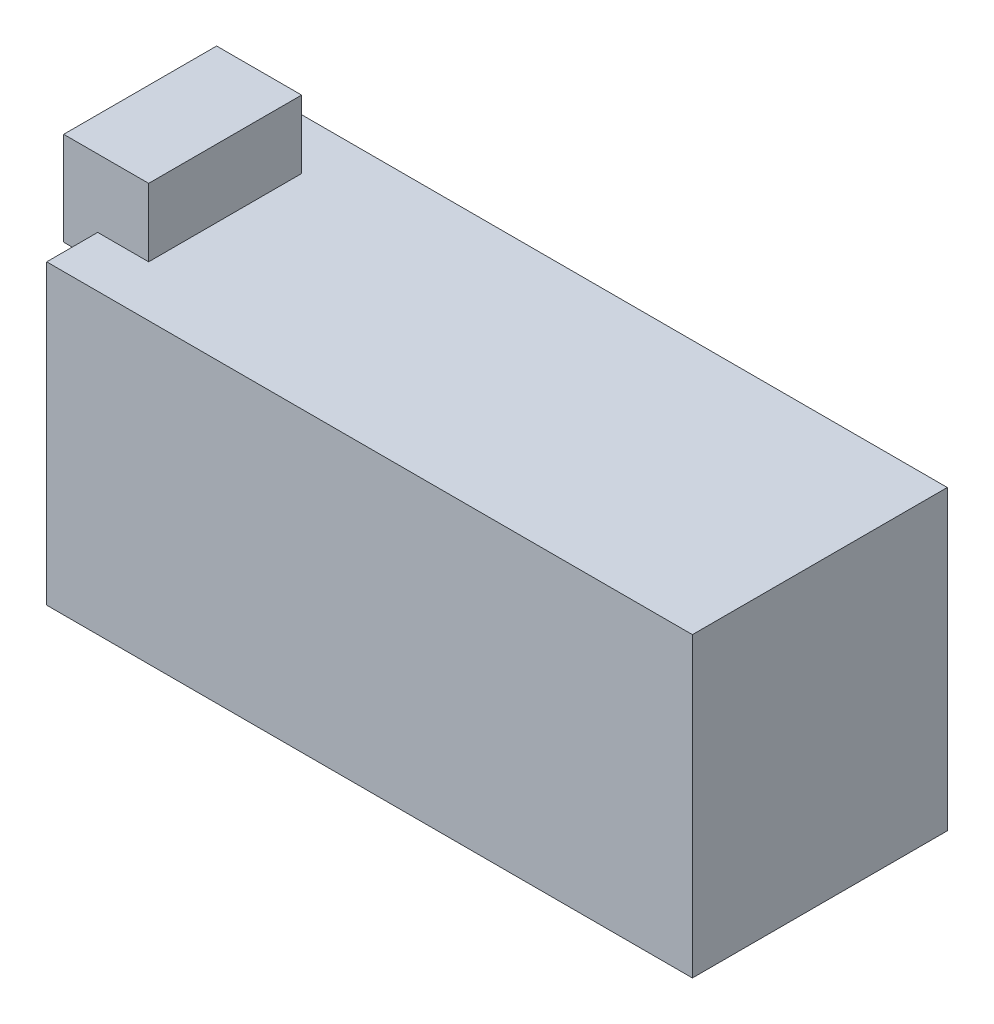
ISO-10303-21;
HEADER;
FILE_DESCRIPTION(('STEP AP214'),'2;1');
FILE_NAME('part.step','',(''),(''),'','','');
FILE_SCHEMA(('AUTOMOTIVE_DESIGN { 1 0 10303 214 1 1 1 1 }'));
ENDSEC;
DATA;
#1=APPLICATION_CONTEXT('core data for automotive mechanical design processes');
#2=APPLICATION_PROTOCOL_DEFINITION('international standard','automotive_design',2000,#1);
#3=PRODUCT_CONTEXT('',#1,'mechanical');
#4=PRODUCT('Part','Part','',(#3));
#5=PRODUCT_RELATED_PRODUCT_CATEGORY('part','',(#4));
#6=PRODUCT_DEFINITION_FORMATION('','',#4);
#7=PRODUCT_DEFINITION_CONTEXT('part definition',#1,'design');
#8=PRODUCT_DEFINITION('design','',#6,#7);
#9=PRODUCT_DEFINITION_SHAPE('','',#8);
#10=(LENGTH_UNIT() NAMED_UNIT(*) SI_UNIT(.MILLI.,.METRE.));
#11=(NAMED_UNIT(*) PLANE_ANGLE_UNIT() SI_UNIT($,.RADIAN.));
#12=(NAMED_UNIT(*) SI_UNIT($,.STERADIAN.) SOLID_ANGLE_UNIT());
#13=UNCERTAINTY_MEASURE_WITH_UNIT(LENGTH_MEASURE(1.E-05),#10,'distance_accuracy_value','');
#14=(GEOMETRIC_REPRESENTATION_CONTEXT(3) GLOBAL_UNCERTAINTY_ASSIGNED_CONTEXT((#13)) GLOBAL_UNIT_ASSIGNED_CONTEXT((#10,
#11,#12)) REPRESENTATION_CONTEXT('',''));
#15=CARTESIAN_POINT('',(0.,0.,0.));
#16=DIRECTION('',(0.,0.,1.));
#17=DIRECTION('',(1.,0.,0.));
#18=AXIS2_PLACEMENT_3D('',#15,#16,#17);
#19=CARTESIAN_POINT('',(38.,-17.5,30.));
#20=DIRECTION('',(-1.,0.,0.));
#21=DIRECTION('',(0.,0.,1.));
#22=AXIS2_PLACEMENT_3D('',#19,#20,#21);
#23=PLANE('',#22);
#24=DIRECTION('',(0.,1.,0.));
#25=VECTOR('',#24,1.);
#26=CARTESIAN_POINT('',(38.,-17.5,0.));
#27=LINE('',#26,#25);
#28=CARTESIAN_POINT('',(38.,-17.5,0.));
#29=VERTEX_POINT('',#28);
#30=CARTESIAN_POINT('',(38.,17.5,0.));
#31=VERTEX_POINT('',#30);
#32=EDGE_CURVE('E169',#29,#31,#27,.T.);
#33=ORIENTED_EDGE('',*,*,#32,.T.);
#34=DIRECTION('',(0.,0.,-1.));
#35=VECTOR('',#34,1.);
#36=CARTESIAN_POINT('',(38.,17.5,30.));
#37=LINE('',#36,#35);
#38=CARTESIAN_POINT('',(38.,17.5,30.));
#39=VERTEX_POINT('',#38);
#40=EDGE_CURVE('E209',#39,#31,#37,.T.);
#41=ORIENTED_EDGE('',*,*,#40,.F.);
#42=DIRECTION('',(0.,1.,0.));
#43=VECTOR('',#42,1.);
#44=CARTESIAN_POINT('',(38.,-17.5,30.));
#45=LINE('',#44,#43);
#46=CARTESIAN_POINT('',(38.,-17.5,30.));
#47=VERTEX_POINT('',#46);
#48=EDGE_CURVE('E170',#47,#39,#45,.T.);
#49=ORIENTED_EDGE('',*,*,#48,.F.);
#50=DIRECTION('',(0.,0.,-1.));
#51=VECTOR('',#50,1.);
#52=CARTESIAN_POINT('',(38.,-17.5,30.));
#53=LINE('',#52,#51);
#54=EDGE_CURVE('E184',#47,#29,#53,.T.);
#55=ORIENTED_EDGE('',*,*,#54,.T.);
#56=EDGE_LOOP('',(#33,#41,#49,#55));
#57=FACE_BOUND('',#56,.T.);
#58=ADVANCED_FACE('F39',(#57),#23,.F.);
#59=CARTESIAN_POINT('',(-38.,17.5,30.));
#60=DIRECTION('',(0.,-1.,0.));
#61=DIRECTION('',(0.,0.,-1.));
#62=AXIS2_PLACEMENT_3D('',#59,#60,#61);
#63=PLANE('',#62);
#64=DIRECTION('',(0.,0.,-1.));
#65=VECTOR('',#64,1.);
#66=CARTESIAN_POINT('',(-38.,17.5,30.));
#67=LINE('',#66,#65);
#68=CARTESIAN_POINT('',(-38.,17.5,6.));
#69=VERTEX_POINT('',#68);
#70=CARTESIAN_POINT('',(-38.,17.5,0.));
#71=VERTEX_POINT('',#70);
#72=EDGE_CURVE('E204',#69,#71,#67,.T.);
#73=ORIENTED_EDGE('',*,*,#72,.F.);
#74=DIRECTION('',(1.,0.,0.));
#75=VECTOR('',#74,1.);
#76=CARTESIAN_POINT('',(-38.,17.5,6.));
#77=LINE('',#76,#75);
#78=CARTESIAN_POINT('',(-32.,17.5,6.));
#79=VERTEX_POINT('',#78);
#80=EDGE_CURVE('E53',#69,#79,#77,.T.);
#81=ORIENTED_EDGE('',*,*,#80,.T.);
#82=DIRECTION('',(0.,0.,1.));
#83=VECTOR('',#82,1.);
#84=CARTESIAN_POINT('',(-32.,17.5,30.));
#85=LINE('',#84,#83);
#86=CARTESIAN_POINT('',(-32.,17.5,24.));
#87=VERTEX_POINT('',#86);
#88=EDGE_CURVE('E11',#79,#87,#85,.T.);
#89=ORIENTED_EDGE('',*,*,#88,.T.);
#90=DIRECTION('',(-1.,0.,0.));
#91=VECTOR('',#90,1.);
#92=CARTESIAN_POINT('',(-38.,17.5,24.));
#93=LINE('',#92,#91);
#94=CARTESIAN_POINT('',(-38.,17.5,24.));
#95=VERTEX_POINT('',#94);
#96=EDGE_CURVE('E159',#87,#95,#93,.T.);
#97=ORIENTED_EDGE('',*,*,#96,.T.);
#98=CARTESIAN_POINT('',(-38.,17.5,30.));
#99=VERTEX_POINT('',#98);
#100=EDGE_CURVE('E205',#99,#95,#67,.T.);
#101=ORIENTED_EDGE('',*,*,#100,.F.);
#102=DIRECTION('',(-1.,0.,0.));
#103=VECTOR('',#102,1.);
#104=CARTESIAN_POINT('',(-38.,17.5,30.));
#105=LINE('',#104,#103);
#106=EDGE_CURVE('E174',#39,#99,#105,.T.);
#107=ORIENTED_EDGE('',*,*,#106,.F.);
#108=ORIENTED_EDGE('',*,*,#40,.T.);
#109=DIRECTION('',(-1.,0.,0.));
#110=VECTOR('',#109,1.);
#111=CARTESIAN_POINT('',(-38.,17.5,0.));
#112=LINE('',#111,#110);
#113=EDGE_CURVE('E188',#31,#71,#112,.T.);
#114=ORIENTED_EDGE('',*,*,#113,.T.);
#115=EDGE_LOOP('',(#73,#81,#89,#97,#101,#107,#108,#114));
#116=FACE_BOUND('',#115,.T.);
#117=ADVANCED_FACE('F225',(#116),#63,.F.);
#118=CARTESIAN_POINT('',(-38.,-17.5,30.));
#119=DIRECTION('',(1.,0.,0.));
#120=DIRECTION('',(0.,0.,-1.));
#121=AXIS2_PLACEMENT_3D('',#118,#119,#120);
#122=PLANE('',#121);
#123=DIRECTION('',(0.,0.,1.));
#124=VECTOR('',#123,1.);
#125=CARTESIAN_POINT('',(-38.,14.5,30.));
#126=LINE('',#125,#124);
#127=CARTESIAN_POINT('',(-38.,14.5,6.));
#128=VERTEX_POINT('',#127);
#129=CARTESIAN_POINT('',(-38.,14.5,24.));
#130=VERTEX_POINT('',#129);
#131=EDGE_CURVE('E213',#128,#130,#126,.T.);
#132=ORIENTED_EDGE('',*,*,#131,.F.);
#133=DIRECTION('',(0.,1.,0.));
#134=VECTOR('',#133,1.);
#135=CARTESIAN_POINT('',(-38.,-17.5,6.));
#136=LINE('',#135,#134);
#137=EDGE_CURVE('E47',#128,#69,#136,.T.);
#138=ORIENTED_EDGE('',*,*,#137,.T.);
#139=ORIENTED_EDGE('',*,*,#72,.T.);
#140=DIRECTION('',(0.,-1.,0.));
#141=VECTOR('',#140,1.);
#142=CARTESIAN_POINT('',(-38.,-17.5,0.));
#143=LINE('',#142,#141);
#144=CARTESIAN_POINT('',(-38.,-17.5,0.));
#145=VERTEX_POINT('',#144);
#146=EDGE_CURVE('E192',#71,#145,#143,.T.);
#147=ORIENTED_EDGE('',*,*,#146,.T.);
#148=DIRECTION('',(0.,0.,-1.));
#149=VECTOR('',#148,1.);
#150=CARTESIAN_POINT('',(-38.,-17.5,30.));
#151=LINE('',#150,#149);
#152=CARTESIAN_POINT('',(-38.,-17.5,30.));
#153=VERTEX_POINT('',#152);
#154=EDGE_CURVE('E200',#153,#145,#151,.T.);
#155=ORIENTED_EDGE('',*,*,#154,.F.);
#156=DIRECTION('',(0.,-1.,0.));
#157=VECTOR('',#156,1.);
#158=CARTESIAN_POINT('',(-38.,-17.5,30.));
#159=LINE('',#158,#157);
#160=EDGE_CURVE('E178',#99,#153,#159,.T.);
#161=ORIENTED_EDGE('',*,*,#160,.F.);
#162=ORIENTED_EDGE('',*,*,#100,.T.);
#163=DIRECTION('',(0.,-1.,0.));
#164=VECTOR('',#163,1.);
#165=CARTESIAN_POINT('',(-38.,-17.5,24.));
#166=LINE('',#165,#164);
#167=EDGE_CURVE('E217',#95,#130,#166,.T.);
#168=ORIENTED_EDGE('',*,*,#167,.T.);
#169=EDGE_LOOP('',(#132,#138,#139,#147,#155,#161,#162,#168));
#170=FACE_BOUND('',#169,.T.);
#171=ADVANCED_FACE('F222',(#170),#122,.F.);
#172=CARTESIAN_POINT('',(-38.,-17.5,30.));
#173=DIRECTION('',(0.,1.,0.));
#174=DIRECTION('',(0.,0.,1.));
#175=AXIS2_PLACEMENT_3D('',#172,#173,#174);
#176=PLANE('',#175);
#177=DIRECTION('',(1.,0.,0.));
#178=VECTOR('',#177,1.);
#179=CARTESIAN_POINT('',(-38.,-17.5,0.));
#180=LINE('',#179,#178);
#181=EDGE_CURVE('E175',#145,#29,#180,.T.);
#182=ORIENTED_EDGE('',*,*,#181,.T.);
#183=ORIENTED_EDGE('',*,*,#54,.F.);
#184=DIRECTION('',(1.,0.,0.));
#185=VECTOR('',#184,1.);
#186=CARTESIAN_POINT('',(-38.,-17.5,30.));
#187=LINE('',#186,#185);
#188=EDGE_CURVE('E181',#153,#47,#187,.T.);
#189=ORIENTED_EDGE('',*,*,#188,.F.);
#190=ORIENTED_EDGE('',*,*,#154,.T.);
#191=EDGE_LOOP('',(#182,#183,#189,#190));
#192=FACE_BOUND('',#191,.T.);
#193=ADVANCED_FACE('F260',(#192),#176,.F.);
#194=CARTESIAN_POINT('',(0.,0.,30.));
#195=DIRECTION('',(0.,0.,-1.));
#196=DIRECTION('',(-1.,0.,0.));
#197=AXIS2_PLACEMENT_3D('',#194,#195,#196);
#198=PLANE('',#197);
#199=ORIENTED_EDGE('',*,*,#48,.T.);
#200=ORIENTED_EDGE('',*,*,#106,.T.);
#201=ORIENTED_EDGE('',*,*,#160,.T.);
#202=ORIENTED_EDGE('',*,*,#188,.T.);
#203=EDGE_LOOP('',(#199,#200,#201,#202));
#204=FACE_BOUND('',#203,.T.);
#205=ADVANCED_FACE('F240',(#204),#198,.F.);
#206=CARTESIAN_POINT('',(0.,0.,0.));
#207=DIRECTION('',(0.,0.,-1.));
#208=DIRECTION('',(-1.,0.,0.));
#209=AXIS2_PLACEMENT_3D('',#206,#207,#208);
#210=PLANE('',#209);
#211=ORIENTED_EDGE('',*,*,#32,.F.);
#212=ORIENTED_EDGE('',*,*,#181,.F.);
#213=ORIENTED_EDGE('',*,*,#146,.F.);
#214=ORIENTED_EDGE('',*,*,#113,.F.);
#215=EDGE_LOOP('',(#211,#212,#213,#214));
#216=FACE_BOUND('',#215,.T.);
#217=ADVANCED_FACE('F233',(#216),#210,.T.);
#218=CARTESIAN_POINT('',(-32.,14.5,6.));
#219=DIRECTION('',(1.,0.,0.));
#220=DIRECTION('',(0.,0.,-1.));
#221=AXIS2_PLACEMENT_3D('',#218,#219,#220);
#222=PLANE('',#221);
#223=ORIENTED_EDGE('',*,*,#88,.F.);
#224=DIRECTION('',(0.,1.,0.));
#225=VECTOR('',#224,1.);
#226=CARTESIAN_POINT('',(-32.,14.5,6.));
#227=LINE('',#226,#225);
#228=CARTESIAN_POINT('',(-32.,25.5,6.));
#229=VERTEX_POINT('',#228);
#230=EDGE_CURVE('E160',#79,#229,#227,.T.);
#231=ORIENTED_EDGE('',*,*,#230,.T.);
#232=DIRECTION('',(0.,0.,-1.));
#233=VECTOR('',#232,1.);
#234=CARTESIAN_POINT('',(-32.,25.5,6.));
#235=LINE('',#234,#233);
#236=CARTESIAN_POINT('',(-32.,25.5,24.));
#237=VERTEX_POINT('',#236);
#238=EDGE_CURVE('E136',#237,#229,#235,.T.);
#239=ORIENTED_EDGE('',*,*,#238,.F.);
#240=DIRECTION('',(0.,1.,0.));
#241=VECTOR('',#240,1.);
#242=CARTESIAN_POINT('',(-32.,14.5,24.));
#243=LINE('',#242,#241);
#244=EDGE_CURVE('E125',#87,#237,#243,.T.);
#245=ORIENTED_EDGE('',*,*,#244,.F.);
#246=EDGE_LOOP('',(#223,#231,#239,#245));
#247=FACE_BOUND('',#246,.T.);
#248=ADVANCED_FACE('F231',(#247),#222,.T.);
#249=CARTESIAN_POINT('',(-42.,14.5,6.));
#250=DIRECTION('',(0.,0.,-1.));
#251=DIRECTION('',(-1.,0.,0.));
#252=AXIS2_PLACEMENT_3D('',#249,#250,#251);
#253=PLANE('',#252);
#254=ORIENTED_EDGE('',*,*,#80,.F.);
#255=ORIENTED_EDGE('',*,*,#137,.F.);
#256=DIRECTION('',(-1.,0.,0.));
#257=VECTOR('',#256,1.);
#258=CARTESIAN_POINT('',(-42.,14.5,6.));
#259=LINE('',#258,#257);
#260=CARTESIAN_POINT('',(-42.,14.5,6.));
#261=VERTEX_POINT('',#260);
#262=EDGE_CURVE('E126',#128,#261,#259,.T.);
#263=ORIENTED_EDGE('',*,*,#262,.T.);
#264=DIRECTION('',(0.,1.,0.));
#265=VECTOR('',#264,1.);
#266=CARTESIAN_POINT('',(-42.,14.5,6.));
#267=LINE('',#266,#265);
#268=CARTESIAN_POINT('',(-42.,25.5,6.));
#269=VERTEX_POINT('',#268);
#270=EDGE_CURVE('E156',#261,#269,#267,.T.);
#271=ORIENTED_EDGE('',*,*,#270,.T.);
#272=DIRECTION('',(-1.,0.,0.));
#273=VECTOR('',#272,1.);
#274=CARTESIAN_POINT('',(-42.,25.5,6.));
#275=LINE('',#274,#273);
#276=EDGE_CURVE('E141',#229,#269,#275,.T.);
#277=ORIENTED_EDGE('',*,*,#276,.F.);
#278=ORIENTED_EDGE('',*,*,#230,.F.);
#279=EDGE_LOOP('',(#254,#255,#263,#271,#277,#278));
#280=FACE_BOUND('',#279,.T.);
#281=ADVANCED_FACE('F229',(#280),#253,.T.);
#282=CARTESIAN_POINT('',(-42.,14.5,24.));
#283=DIRECTION('',(0.,0.,1.));
#284=DIRECTION('',(1.,0.,0.));
#285=AXIS2_PLACEMENT_3D('',#282,#283,#284);
#286=PLANE('',#285);
#287=ORIENTED_EDGE('',*,*,#96,.F.);
#288=ORIENTED_EDGE('',*,*,#244,.T.);
#289=DIRECTION('',(1.,0.,0.));
#290=VECTOR('',#289,1.);
#291=CARTESIAN_POINT('',(-42.,25.5,24.));
#292=LINE('',#291,#290);
#293=CARTESIAN_POINT('',(-42.,25.5,24.));
#294=VERTEX_POINT('',#293);
#295=EDGE_CURVE('E129',#294,#237,#292,.T.);
#296=ORIENTED_EDGE('',*,*,#295,.F.);
#297=DIRECTION('',(0.,1.,0.));
#298=VECTOR('',#297,1.);
#299=CARTESIAN_POINT('',(-42.,14.5,24.));
#300=LINE('',#299,#298);
#301=CARTESIAN_POINT('',(-42.,14.5,24.));
#302=VERTEX_POINT('',#301);
#303=EDGE_CURVE('E113',#302,#294,#300,.T.);
#304=ORIENTED_EDGE('',*,*,#303,.F.);
#305=DIRECTION('',(1.,0.,0.));
#306=VECTOR('',#305,1.);
#307=CARTESIAN_POINT('',(-42.,14.5,24.));
#308=LINE('',#307,#306);
#309=EDGE_CURVE('E151',#302,#130,#308,.T.);
#310=ORIENTED_EDGE('',*,*,#309,.T.);
#311=ORIENTED_EDGE('',*,*,#167,.F.);
#312=EDGE_LOOP('',(#287,#288,#296,#304,#310,#311));
#313=FACE_BOUND('',#312,.T.);
#314=ADVANCED_FACE('F130',(#313),#286,.T.);
#315=CARTESIAN_POINT('',(0.,14.5,0.));
#316=DIRECTION('',(0.,1.,0.));
#317=DIRECTION('',(0.,0.,1.));
#318=AXIS2_PLACEMENT_3D('',#315,#316,#317);
#319=PLANE('',#318);
#320=ORIENTED_EDGE('',*,*,#262,.F.);
#321=ORIENTED_EDGE('',*,*,#131,.T.);
#322=ORIENTED_EDGE('',*,*,#309,.F.);
#323=DIRECTION('',(0.,0.,1.));
#324=VECTOR('',#323,1.);
#325=CARTESIAN_POINT('',(-42.,14.5,6.));
#326=LINE('',#325,#324);
#327=EDGE_CURVE('E120',#261,#302,#326,.T.);
#328=ORIENTED_EDGE('',*,*,#327,.F.);
#329=EDGE_LOOP('',(#320,#321,#322,#328));
#330=FACE_BOUND('',#329,.T.);
#331=ADVANCED_FACE('F263',(#330),#319,.F.);
#332=CARTESIAN_POINT('',(-42.,14.5,6.));
#333=DIRECTION('',(-1.,0.,0.));
#334=DIRECTION('',(0.,0.,1.));
#335=AXIS2_PLACEMENT_3D('',#332,#333,#334);
#336=PLANE('',#335);
#337=ORIENTED_EDGE('',*,*,#303,.T.);
#338=DIRECTION('',(0.,0.,1.));
#339=VECTOR('',#338,1.);
#340=CARTESIAN_POINT('',(-42.,25.5,6.));
#341=LINE('',#340,#339);
#342=EDGE_CURVE('E118',#269,#294,#341,.T.);
#343=ORIENTED_EDGE('',*,*,#342,.F.);
#344=ORIENTED_EDGE('',*,*,#270,.F.);
#345=ORIENTED_EDGE('',*,*,#327,.T.);
#346=EDGE_LOOP('',(#337,#343,#344,#345));
#347=FACE_BOUND('',#346,.T.);
#348=ADVANCED_FACE('F115',(#347),#336,.T.);
#349=CARTESIAN_POINT('',(0.,25.5,0.));
#350=DIRECTION('',(0.,1.,0.));
#351=DIRECTION('',(0.,0.,1.));
#352=AXIS2_PLACEMENT_3D('',#349,#350,#351);
#353=PLANE('',#352);
#354=ORIENTED_EDGE('',*,*,#342,.T.);
#355=ORIENTED_EDGE('',*,*,#295,.T.);
#356=ORIENTED_EDGE('',*,*,#238,.T.);
#357=ORIENTED_EDGE('',*,*,#276,.T.);
#358=EDGE_LOOP('',(#354,#355,#356,#357));
#359=FACE_BOUND('',#358,.T.);
#360=ADVANCED_FACE('F139',(#359),#353,.T.);
#361=CLOSED_SHELL('',(#58,#117,#171,#193,#205,#217,#248,#281,#314,#331,#348,#360));
#362=MANIFOLD_SOLID_BREP('B2',#361);
#363=ADVANCED_BREP_SHAPE_REPRESENTATION('',(#18,#362),#14);
#364=SHAPE_DEFINITION_REPRESENTATION(#9,#363);
ENDSEC;
END-ISO-10303-21;
